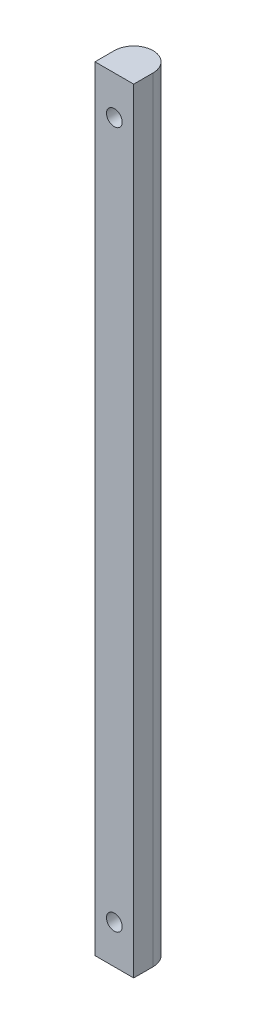
ISO-10303-21;
HEADER;
FILE_DESCRIPTION(('STEP AP214'),'2;1');
FILE_NAME('part.step','',(''),(''),'','','');
FILE_SCHEMA(('AUTOMOTIVE_DESIGN { 1 0 10303 214 1 1 1 1 }'));
ENDSEC;
DATA;
#1=APPLICATION_CONTEXT('core data for automotive mechanical design processes');
#2=APPLICATION_PROTOCOL_DEFINITION('international standard','automotive_design',2000,#1);
#3=PRODUCT_CONTEXT('',#1,'mechanical');
#4=PRODUCT('Part','Part','',(#3));
#5=PRODUCT_RELATED_PRODUCT_CATEGORY('part','',(#4));
#6=PRODUCT_DEFINITION_FORMATION('','',#4);
#7=PRODUCT_DEFINITION_CONTEXT('part definition',#1,'design');
#8=PRODUCT_DEFINITION('design','',#6,#7);
#9=PRODUCT_DEFINITION_SHAPE('','',#8);
#10=(LENGTH_UNIT() NAMED_UNIT(*) SI_UNIT(.MILLI.,.METRE.));
#11=(NAMED_UNIT(*) PLANE_ANGLE_UNIT() SI_UNIT($,.RADIAN.));
#12=(NAMED_UNIT(*) SI_UNIT($,.STERADIAN.) SOLID_ANGLE_UNIT());
#13=UNCERTAINTY_MEASURE_WITH_UNIT(LENGTH_MEASURE(1.E-05),#10,'distance_accuracy_value','');
#14=(GEOMETRIC_REPRESENTATION_CONTEXT(3) GLOBAL_UNCERTAINTY_ASSIGNED_CONTEXT((#13)) GLOBAL_UNIT_ASSIGNED_CONTEXT((#10,
#11,#12)) REPRESENTATION_CONTEXT('',''));
#15=CARTESIAN_POINT('',(0.,0.,0.));
#16=DIRECTION('',(0.,0.,1.));
#17=DIRECTION('',(1.,0.,0.));
#18=AXIS2_PLACEMENT_3D('',#15,#16,#17);
#19=CARTESIAN_POINT('',(0.,63.5,-3.175));
#20=DIRECTION('',(0.,-1.,0.));
#21=DIRECTION('',(0.,0.,-1.));
#22=AXIS2_PLACEMENT_3D('',#19,#20,#21);
#23=CYLINDRICAL_SURFACE('',#22,3.175);
#24=CARTESIAN_POINT('',(0.,55.86095,-6.35));
#25=CARTESIAN_POINT('',(0.0691991170808213,55.8609567880684,-6.34999494878284));
#26=CARTESIAN_POINT('',(0.138514448645236,55.8665553419764,-6.34771128002319));
#27=CARTESIAN_POINT('',(0.275187458737665,55.8887540186759,-6.33879808003825));
#28=CARTESIAN_POINT('',(0.342539383129634,55.9053836315021,-6.3321569001181));
#29=CARTESIAN_POINT('',(0.473087021310062,55.9489358399123,-6.31524364494565));
#30=CARTESIAN_POINT('',(0.536295708180401,55.9758243126415,-6.30498361510931));
#31=CARTESIAN_POINT('',(0.657246364636683,56.0389936535068,-6.28183907891045));
#32=CARTESIAN_POINT('',(0.714990136684524,56.0752714099811,-6.26895544232704));
#33=CARTESIAN_POINT('',(0.826242629051789,56.1580379875598,-6.24116693926225));
#34=CARTESIAN_POINT('',(0.879453289167607,56.2049058060068,-6.22619808843745));
#35=CARTESIAN_POINT('',(0.977512911869507,56.3067217100382,-6.19621300876413));
#36=CARTESIAN_POINT('',(1.0223576745505,56.361673829532,-6.18119675994665));
#37=CARTESIAN_POINT('',(1.10445361995858,56.4811769758469,-6.15204466177736));
#38=CARTESIAN_POINT('',(1.14125872964486,56.5460539994784,-6.13798144758871));
#39=CARTESIAN_POINT('',(1.20330090876947,56.6817334664035,-6.11333536275321));
#40=CARTESIAN_POINT('',(1.22854363847174,56.7525329902692,-6.10275078988582));
#41=CARTESIAN_POINT('',(1.26552995014933,56.894620296577,-6.08694932324813));
#42=CARTESIAN_POINT('',(1.27784529118986,56.9657331564385,-6.08150625748732));
#43=CARTESIAN_POINT('',(1.29041253820246,57.1092083227824,-6.07595030426477));
#44=CARTESIAN_POINT('',(1.29067062652423,57.1815699699077,-6.07583468515811));
#45=CARTESIAN_POINT('',(1.27954838927627,57.3199242161316,-6.08075429064617));
#46=CARTESIAN_POINT('',(1.26900566717996,57.385999922727,-6.08541882210551));
#47=CARTESIAN_POINT('',(1.23798066165121,57.5153478615879,-6.09874946121189));
#48=CARTESIAN_POINT('',(1.21749658508013,57.5786195858468,-6.10741629074641));
#49=CARTESIAN_POINT('',(1.16677664432287,57.7021162330619,-6.12796740817153));
#50=CARTESIAN_POINT('',(1.13634738556803,57.7622507786925,-6.13991468325851));
#51=CARTESIAN_POINT('',(1.06673695185949,57.8767858208651,-6.16566416352442));
#52=CARTESIAN_POINT('',(1.02755242891495,57.9311841121335,-6.17946707748856));
#53=CARTESIAN_POINT('',(0.937867550666353,58.0372738968994,-6.20871449812304));
#54=CARTESIAN_POINT('',(0.886713453390292,58.0884023759712,-6.22420207670568));
#55=CARTESIAN_POINT('',(0.776396004733482,58.1815383694806,-6.25413921024311));
#56=CARTESIAN_POINT('',(0.717230965144651,58.2235439565085,-6.26858854541569));
#57=CARTESIAN_POINT('',(0.590933707198553,58.2980111190829,-6.29520310800086));
#58=CARTESIAN_POINT('',(0.523660769986691,58.3302547761548,-6.30731426034368));
#59=CARTESIAN_POINT('',(0.384028809868178,58.3827722116859,-6.327476877027));
#60=CARTESIAN_POINT('',(0.31167247375507,58.4030522609455,-6.33553046784028));
#61=CARTESIAN_POINT('',(0.16864189868142,58.4299140357149,-6.34627953592641));
#62=CARTESIAN_POINT('',(0.0981318255811806,58.4372520101282,-6.34927037549045));
#63=CARTESIAN_POINT('',(-0.043169177857986,58.440262047857,-6.35049175469347));
#64=CARTESIAN_POINT('',(-0.113960027542248,58.4359372488407,-6.34872357466488));
#65=CARTESIAN_POINT('',(-0.250344995389918,58.4162954737281,-6.34081834382161));
#66=CARTESIAN_POINT('',(-0.316027571427203,58.4014999882194,-6.33488866781712));
#67=CARTESIAN_POINT('',(-0.443913481919008,58.3620521638474,-6.31947407528922));
#68=CARTESIAN_POINT('',(-0.506116370652852,58.3373985655176,-6.30998870450208));
#69=CARTESIAN_POINT('',(-0.627434557573652,58.2781286267577,-6.28801625437917));
#70=CARTESIAN_POINT('',(-0.686395814260256,58.2432288999057,-6.27544574313742));
#71=CARTESIAN_POINT('',(-0.797833822360258,58.1647706254623,-6.24865843400418));
#72=CARTESIAN_POINT('',(-0.850307918909784,58.1212085517127,-6.23444096667786));
#73=CARTESIAN_POINT('',(-0.951026543140731,58.0231924219967,-6.20470562715203));
#74=CARTESIAN_POINT('',(-0.998741114888624,57.9681992712312,-6.18916505256559));
#75=CARTESIAN_POINT('',(-1.08440104458421,57.8507208562238,-6.15941967611857));
#76=CARTESIAN_POINT('',(-1.12234458519762,57.7882342014126,-6.1452151230588));
#77=CARTESIAN_POINT('',(-1.18768318457141,57.6564805698983,-6.1197043178253));
#78=CARTESIAN_POINT('',(-1.21495482686028,57.5871452495226,-6.10843245344576));
#79=CARTESIAN_POINT('',(-1.25721698429186,57.4442685596938,-6.09057314753681));
#80=CARTESIAN_POINT('',(-1.2722169384638,57.3707304695601,-6.08398210616892));
#81=CARTESIAN_POINT('',(-1.28859508015926,57.2273829041568,-6.07676160650549));
#82=CARTESIAN_POINT('',(-1.2908967198223,57.1576986917889,-6.07572814139085));
#83=CARTESIAN_POINT('',(-1.28425228510169,57.0189837792386,-6.07867601428325));
#84=CARTESIAN_POINT('',(-1.2753077390997,56.9499529915389,-6.08265667086014));
#85=CARTESIAN_POINT('',(-1.24718689304565,56.8174792180329,-6.09482321951612));
#86=CARTESIAN_POINT('',(-1.22845580313664,56.7539233091184,-6.10282559452904));
#87=CARTESIAN_POINT('',(-1.18171667348739,56.6308345128285,-6.12199939284952));
#88=CARTESIAN_POINT('',(-1.15370605515248,56.5713027492249,-6.1331716968927));
#89=CARTESIAN_POINT('',(-1.08731746525223,56.4541668209852,-6.15823530583221));
#90=CARTESIAN_POINT('',(-1.04843009803694,56.3968776071093,-6.17224719173308));
#91=CARTESIAN_POINT('',(-0.962125250887948,56.2893483068532,-6.20105482524188));
#92=CARTESIAN_POINT('',(-0.914705059538204,56.2391104701986,-6.21585082095353));
#93=CARTESIAN_POINT('',(-0.80886574807768,56.1436193981101,-6.24576238710602));
#94=CARTESIAN_POINT('',(-0.749919587011669,56.0989332418308,-6.26083186881097));
#95=CARTESIAN_POINT('',(-0.624798009827094,56.0200690195441,-6.28857548380922));
#96=CARTESIAN_POINT('',(-0.558619280580835,55.9858957969248,-6.30124851200542));
#97=CARTESIAN_POINT('',(-0.422063336305997,55.9298091529994,-6.3225671606999));
#98=CARTESIAN_POINT('',(-0.351782819012536,55.9076866588813,-6.33128099638565));
#99=CARTESIAN_POINT('',(-0.208203856400575,55.8757651689365,-6.34397908859924));
#100=CARTESIAN_POINT('',(-0.134915707477548,55.8659272479027,-6.34797828179879));
#101=CARTESIAN_POINT('',(-0.0409571719211373,55.8614359448173,-6.34980333267174));
#102=CARTESIAN_POINT('',(-0.0204836774519347,55.8609479906593,-6.35000149521421));
#103=CARTESIAN_POINT('',(0.,55.86095,-6.35));
#104=B_SPLINE_CURVE_WITH_KNOTS('',3,(#24,#25,#26,#27,#28,#29,#30,#31,#32,#33,#34,#35,#36,#37,
#38,#39,#40,#41,#42,#43,#44,#45,#46,#47,#48,#49,#50,#51,#52,#53,#54,#55,#56,#57,#58,#59,#60,#61,
#62,#63,#64,#65,#66,#67,#68,#69,#70,#71,#72,#73,#74,#75,#76,#77,#78,#79,#80,#81,#82,#83,#84,#85,
#86,#87,#88,#89,#90,#91,#92,#93,#94,#95,#96,#97,#98,#99,#100,#101,#102,#103),.UNSPECIFIED.,.T.,
.F.,(4,2,2,2,2,2,2,2,2,2,2,2,2,2,2,2,2,2,2,2,2,2,2,2,2,2,2,2,2,2,2,2,2,2,2,2,2,2,2,4),(0.,
0.207541326616696,0.41563973492106,0.623051920280879,0.8303954558898,1.04686045973998,
1.26343384409847,1.49000426712627,1.71646365569271,1.93242050038482,2.14826661210771,
2.3485536522472,2.54887683192717,2.75335367180529,2.9579088373367,3.1787983054186,
3.39973439591492,3.62529000925708,3.85072729091376,4.0624909156462,4.27419757470954,
4.47604123804456,4.67791069704711,4.88599585529143,5.09416589223806,5.31648608861492,
5.53884760496836,5.76370959278771,5.98839846019679,6.19650800502098,6.40458927035164,
6.60393683866938,6.80333984820438,7.01437321947173,7.22547376814521,7.45085448578607,
7.67633888306081,7.89777542509606,8.11850852243959,8.17994297090803),.UNSPECIFIED.);
#105=CARTESIAN_POINT('',(0.,55.86095,-6.35));
#106=VERTEX_POINT('',#105);
#107=EDGE_CURVE('E11',#106,#106,#104,.T.);
#108=ORIENTED_EDGE('',*,*,#107,.T.);
#109=EDGE_LOOP('',(#108));
#110=FACE_BOUND('',#109,.T.);
#111=CARTESIAN_POINT('',(0.,-58.43905,-6.35));
#112=CARTESIAN_POINT('',(0.069199117080821,-58.4390432119316,-6.34999494878284));
#113=CARTESIAN_POINT('',(0.138514448645235,-58.4334446580236,-6.34771128002319));
#114=CARTESIAN_POINT('',(0.275187458737664,-58.4112459813241,-6.33879808003825));
#115=CARTESIAN_POINT('',(0.342539383129634,-58.3946163684979,-6.3321569001181));
#116=CARTESIAN_POINT('',(0.473087021310062,-58.3510641600877,-6.31524364494565));
#117=CARTESIAN_POINT('',(0.536295708180401,-58.3241756873584,-6.30498361510931));
#118=CARTESIAN_POINT('',(0.657246364636683,-58.2610063464932,-6.28183907891045));
#119=CARTESIAN_POINT('',(0.714990136684524,-58.2247285900189,-6.26895544232704));
#120=CARTESIAN_POINT('',(0.826242629051792,-58.1419620124402,-6.24116693926225));
#121=CARTESIAN_POINT('',(0.879453289167612,-58.0950941939932,-6.22619808843745));
#122=CARTESIAN_POINT('',(0.977512911869511,-57.9932782899618,-6.19621300876413));
#123=CARTESIAN_POINT('',(1.0223576745505,-57.938326170468,-6.18119675994665));
#124=CARTESIAN_POINT('',(1.10445361995858,-57.8188230241531,-6.15204466177736));
#125=CARTESIAN_POINT('',(1.14125872964486,-57.7539460005216,-6.1379814475887));
#126=CARTESIAN_POINT('',(1.20330090876947,-57.6182665335965,-6.11333536275321));
#127=CARTESIAN_POINT('',(1.22854363847174,-57.5474670097308,-6.10275078988582));
#128=CARTESIAN_POINT('',(1.26552995014934,-57.405379703423,-6.08694932324813));
#129=CARTESIAN_POINT('',(1.27784529118986,-57.3342668435615,-6.08150625748732));
#130=CARTESIAN_POINT('',(1.29041253820246,-57.1907916772176,-6.07595030426477));
#131=CARTESIAN_POINT('',(1.29067062652423,-57.1184300300923,-6.07583468515811));
#132=CARTESIAN_POINT('',(1.27954838927627,-56.9800757838684,-6.08075429064617));
#133=CARTESIAN_POINT('',(1.26900566717996,-56.914000077273,-6.08541882210551));
#134=CARTESIAN_POINT('',(1.23798066165121,-56.7846521384121,-6.09874946121189));
#135=CARTESIAN_POINT('',(1.21749658508013,-56.7213804141532,-6.10741629074641));
#136=CARTESIAN_POINT('',(1.16677664432287,-56.5978837669381,-6.12796740817153));
#137=CARTESIAN_POINT('',(1.13634738556803,-56.5377492213075,-6.1399146832585));
#138=CARTESIAN_POINT('',(1.06673695185949,-56.423214179135,-6.16566416352442));
#139=CARTESIAN_POINT('',(1.02755242891496,-56.3688158878665,-6.17946707748856));
#140=CARTESIAN_POINT('',(0.937867550666353,-56.2627261031006,-6.20871449812304));
#141=CARTESIAN_POINT('',(0.886713453390292,-56.2115976240288,-6.22420207670568));
#142=CARTESIAN_POINT('',(0.776396004733482,-56.1184616305194,-6.25413921024311));
#143=CARTESIAN_POINT('',(0.717230965144651,-56.0764560434915,-6.26858854541569));
#144=CARTESIAN_POINT('',(0.590933707198553,-56.0019888809171,-6.29520310800086));
#145=CARTESIAN_POINT('',(0.523660769986691,-55.9697452238452,-6.30731426034368));
#146=CARTESIAN_POINT('',(0.384028809868178,-55.9172277883141,-6.327476877027));
#147=CARTESIAN_POINT('',(0.31167247375507,-55.8969477390545,-6.33553046784028));
#148=CARTESIAN_POINT('',(0.16864189868142,-55.8700859642851,-6.34627953592641));
#149=CARTESIAN_POINT('',(0.0981318255811804,-55.8627479898718,-6.34927037549045));
#150=CARTESIAN_POINT('',(-0.0431691778579861,-55.859737952143,-6.35049175469347));
#151=CARTESIAN_POINT('',(-0.113960027542248,-55.8640627511593,-6.34872357466488));
#152=CARTESIAN_POINT('',(-0.25034499538992,-55.8837045262719,-6.34081834382161));
#153=CARTESIAN_POINT('',(-0.316027571427207,-55.8985000117806,-6.33488866781712));
#154=CARTESIAN_POINT('',(-0.443913481919012,-55.9379478361526,-6.31947407528921));
#155=CARTESIAN_POINT('',(-0.506116370652853,-55.9626014344824,-6.30998870450208));
#156=CARTESIAN_POINT('',(-0.627434557573654,-56.0218713732423,-6.28801625437917));
#157=CARTESIAN_POINT('',(-0.686395814260261,-56.0567711000943,-6.27544574313742));
#158=CARTESIAN_POINT('',(-0.797833822360263,-56.1352293745377,-6.24865843400418));
#159=CARTESIAN_POINT('',(-0.850307918909786,-56.1787914482873,-6.23444096667786));
#160=CARTESIAN_POINT('',(-0.951026543140731,-56.2768075780033,-6.20470562715203));
#161=CARTESIAN_POINT('',(-0.998741114888624,-56.3318007287688,-6.18916505256559));
#162=CARTESIAN_POINT('',(-1.08440104458421,-56.4492791437762,-6.15941967611857));
#163=CARTESIAN_POINT('',(-1.12234458519762,-56.5117657985874,-6.1452151230588));
#164=CARTESIAN_POINT('',(-1.18768318457141,-56.6435194301017,-6.1197043178253));
#165=CARTESIAN_POINT('',(-1.21495482686028,-56.7128547504774,-6.10843245344576));
#166=CARTESIAN_POINT('',(-1.25721698429186,-56.8557314403062,-6.09057314753681));
#167=CARTESIAN_POINT('',(-1.2722169384638,-56.9292695304399,-6.08398210616892));
#168=CARTESIAN_POINT('',(-1.28859508015926,-57.0726170958432,-6.07676160650549));
#169=CARTESIAN_POINT('',(-1.2908967198223,-57.1423013082111,-6.07572814139085));
#170=CARTESIAN_POINT('',(-1.28425228510169,-57.2810162207614,-6.07867601428325));
#171=CARTESIAN_POINT('',(-1.2753077390997,-57.3500470084611,-6.08265667086014));
#172=CARTESIAN_POINT('',(-1.24718689304565,-57.4825207819671,-6.09482321951612));
#173=CARTESIAN_POINT('',(-1.22845580313664,-57.5460766908816,-6.10282559452904));
#174=CARTESIAN_POINT('',(-1.18171667348739,-57.6691654871715,-6.12199939284952));
#175=CARTESIAN_POINT('',(-1.15370605515248,-57.7286972507751,-6.1331716968927));
#176=CARTESIAN_POINT('',(-1.08731746525223,-57.8458331790148,-6.15823530583221));
#177=CARTESIAN_POINT('',(-1.04843009803694,-57.9031223928907,-6.17224719173308));
#178=CARTESIAN_POINT('',(-0.962125250887948,-58.0106516931468,-6.20105482524188));
#179=CARTESIAN_POINT('',(-0.914705059538204,-58.0608895298014,-6.21585082095353));
#180=CARTESIAN_POINT('',(-0.80886574807768,-58.1563806018899,-6.24576238710602));
#181=CARTESIAN_POINT('',(-0.749919587011669,-58.2010667581692,-6.26083186881097));
#182=CARTESIAN_POINT('',(-0.624798009827094,-58.2799309804559,-6.28857548380922));
#183=CARTESIAN_POINT('',(-0.558619280580835,-58.3141042030753,-6.30124851200542));
#184=CARTESIAN_POINT('',(-0.422063336305997,-58.3701908470006,-6.3225671606999));
#185=CARTESIAN_POINT('',(-0.351782819012536,-58.3923133411187,-6.33128099638565));
#186=CARTESIAN_POINT('',(-0.208203856400575,-58.4242348310635,-6.34397908859924));
#187=CARTESIAN_POINT('',(-0.134915707477548,-58.4340727520973,-6.34797828179879));
#188=CARTESIAN_POINT('',(-0.0409571719211373,-58.4385640551827,-6.34980333267174));
#189=CARTESIAN_POINT('',(-0.0204836774519347,-58.4390520093407,-6.35000149521421));
#190=CARTESIAN_POINT('',(0.,-58.43905,-6.35));
#191=B_SPLINE_CURVE_WITH_KNOTS('',3,(#111,#112,#113,#114,#115,#116,#117,#118,#119,#120,#121,
#122,#123,#124,#125,#126,#127,#128,#129,#130,#131,#132,#133,#134,#135,#136,#137,#138,#139,#140,
#141,#142,#143,#144,#145,#146,#147,#148,#149,#150,#151,#152,#153,#154,#155,#156,#157,#158,#159,
#160,#161,#162,#163,#164,#165,#166,#167,#168,#169,#170,#171,#172,#173,#174,#175,#176,#177,#178,
#179,#180,#181,#182,#183,#184,#185,#186,#187,#188,#189,#190),.UNSPECIFIED.,.T.,.F.,(4,2,2,2,2,2,
2,2,2,2,2,2,2,2,2,2,2,2,2,2,2,2,2,2,2,2,2,2,2,2,2,2,2,2,2,2,2,2,2,4),(0.,0.207541326616695,
0.41563973492106,0.623051920280879,0.8303954558898,1.04686045973999,1.26343384409847,
1.49000426712627,1.71646365569271,1.93242050038484,2.14826661210771,2.3485536522472,
2.54887683192717,2.75335367180528,2.9579088373367,3.1787983054186,3.39973439591492,
3.62529000925708,3.85072729091376,4.0624909156462,4.27419757470954,4.47604123804456,
4.67791069704711,4.88599585529144,5.09416589223806,5.31648608861492,5.53884760496836,
5.76370959278772,5.98839846019679,6.19650800502098,6.40458927035164,6.60393683866938,
6.80333984820438,7.01437321947173,7.22547376814521,7.45085448578607,7.67633888306081,
7.89777542509606,8.1185085224396,8.17994297090803),.UNSPECIFIED.);
#192=CARTESIAN_POINT('',(0.,-58.43905,-6.35));
#193=VERTEX_POINT('',#192);
#194=EDGE_CURVE('E57',#193,#193,#191,.T.);
#195=ORIENTED_EDGE('',*,*,#194,.T.);
#196=EDGE_LOOP('',(#195));
#197=FACE_BOUND('',#196,.T.);
#198=CARTESIAN_POINT('',(0.,-63.5,-3.175));
#199=DIRECTION('',(0.,1.,0.));
#200=DIRECTION('',(0.,0.,-1.));
#201=AXIS2_PLACEMENT_3D('',#198,#199,#200);
#202=CIRCLE('',#201,3.175);
#203=CARTESIAN_POINT('',(3.175,-63.5,-3.175));
#204=VERTEX_POINT('',#203);
#205=CARTESIAN_POINT('',(-3.175,-63.5,-3.175));
#206=VERTEX_POINT('',#205);
#207=EDGE_CURVE('E120',#204,#206,#202,.T.);
#208=ORIENTED_EDGE('',*,*,#207,.T.);
#209=DIRECTION('',(0.,-1.,0.));
#210=VECTOR('',#209,1.);
#211=CARTESIAN_POINT('',(-3.175,63.5,-3.175));
#212=LINE('',#211,#210);
#213=CARTESIAN_POINT('',(-3.175,63.5,-3.175));
#214=VERTEX_POINT('',#213);
#215=EDGE_CURVE('E109',#214,#206,#212,.T.);
#216=ORIENTED_EDGE('',*,*,#215,.F.);
#217=CARTESIAN_POINT('',(0.,63.5,-3.175));
#218=DIRECTION('',(0.,1.,0.));
#219=DIRECTION('',(0.,0.,-1.));
#220=AXIS2_PLACEMENT_3D('',#217,#218,#219);
#221=CIRCLE('',#220,3.175);
#222=CARTESIAN_POINT('',(3.175,63.5,-3.175));
#223=VERTEX_POINT('',#222);
#224=EDGE_CURVE('E101',#223,#214,#221,.T.);
#225=ORIENTED_EDGE('',*,*,#224,.F.);
#226=DIRECTION('',(0.,-1.,0.));
#227=VECTOR('',#226,1.);
#228=CARTESIAN_POINT('',(3.175,63.5,-3.175));
#229=LINE('',#228,#227);
#230=EDGE_CURVE('E116',#223,#204,#229,.T.);
#231=ORIENTED_EDGE('',*,*,#230,.T.);
#232=EDGE_LOOP('',(#208,#216,#225,#231));
#233=FACE_BOUND('',#232,.T.);
#234=ADVANCED_FACE('F43',(#110,#197,#233),#23,.T.);
#235=CARTESIAN_POINT('',(-3.175,63.5,-3.175));
#236=DIRECTION('',(1.,0.,0.));
#237=DIRECTION('',(0.,0.,-1.));
#238=AXIS2_PLACEMENT_3D('',#235,#236,#237);
#239=PLANE('',#238);
#240=DIRECTION('',(0.,0.,1.));
#241=VECTOR('',#240,1.);
#242=CARTESIAN_POINT('',(-3.175,-63.5,-3.175));
#243=LINE('',#242,#241);
#244=CARTESIAN_POINT('',(-3.175,-63.5,0.));
#245=VERTEX_POINT('',#244);
#246=EDGE_CURVE('E107',#206,#245,#243,.T.);
#247=ORIENTED_EDGE('',*,*,#246,.T.);
#248=DIRECTION('',(0.,-1.,0.));
#249=VECTOR('',#248,1.);
#250=CARTESIAN_POINT('',(-3.175,63.5,0.));
#251=LINE('',#250,#249);
#252=CARTESIAN_POINT('',(-3.175,63.5,0.));
#253=VERTEX_POINT('',#252);
#254=EDGE_CURVE('E105',#253,#245,#251,.T.);
#255=ORIENTED_EDGE('',*,*,#254,.F.);
#256=DIRECTION('',(0.,0.,1.));
#257=VECTOR('',#256,1.);
#258=CARTESIAN_POINT('',(-3.175,63.5,-3.175));
#259=LINE('',#258,#257);
#260=EDGE_CURVE('E96',#214,#253,#259,.T.);
#261=ORIENTED_EDGE('',*,*,#260,.F.);
#262=ORIENTED_EDGE('',*,*,#215,.T.);
#263=EDGE_LOOP('',(#247,#255,#261,#262));
#264=FACE_BOUND('',#263,.T.);
#265=ADVANCED_FACE('F106',(#264),#239,.F.);
#266=CARTESIAN_POINT('',(-3.175,63.5,0.));
#267=DIRECTION('',(0.,0.,-1.));
#268=DIRECTION('',(-1.,0.,0.));
#269=AXIS2_PLACEMENT_3D('',#266,#267,#268);
#270=PLANE('',#269);
#271=CARTESIAN_POINT('',(0.,57.15,0.));
#272=DIRECTION('',(0.,0.,1.));
#273=DIRECTION('',(1.,0.,0.));
#274=AXIS2_PLACEMENT_3D('',#271,#272,#273);
#275=CIRCLE('',#274,1.28905);
#276=CARTESIAN_POINT('',(1.28905,57.15,0.));
#277=VERTEX_POINT('',#276);
#278=EDGE_CURVE('E177',#277,#277,#275,.T.);
#279=ORIENTED_EDGE('',*,*,#278,.F.);
#280=EDGE_LOOP('',(#279));
#281=FACE_BOUND('',#280,.T.);
#282=CARTESIAN_POINT('',(0.,-57.15,0.));
#283=DIRECTION('',(0.,0.,1.));
#284=DIRECTION('',(1.,0.,0.));
#285=AXIS2_PLACEMENT_3D('',#282,#283,#284);
#286=CIRCLE('',#285,1.28905);
#287=CARTESIAN_POINT('',(1.28905,-57.15,0.));
#288=VERTEX_POINT('',#287);
#289=EDGE_CURVE('E124',#288,#288,#286,.T.);
#290=ORIENTED_EDGE('',*,*,#289,.F.);
#291=EDGE_LOOP('',(#290));
#292=FACE_BOUND('',#291,.T.);
#293=DIRECTION('',(1.,0.,0.));
#294=VECTOR('',#293,1.);
#295=CARTESIAN_POINT('',(-3.175,-63.5,0.));
#296=LINE('',#295,#294);
#297=CARTESIAN_POINT('',(3.175,-63.5,0.));
#298=VERTEX_POINT('',#297);
#299=EDGE_CURVE('E82',#245,#298,#296,.T.);
#300=ORIENTED_EDGE('',*,*,#299,.T.);
#301=DIRECTION('',(0.,-1.,0.));
#302=VECTOR('',#301,1.);
#303=CARTESIAN_POINT('',(3.175,63.5,0.));
#304=LINE('',#303,#302);
#305=CARTESIAN_POINT('',(3.175,63.5,0.));
#306=VERTEX_POINT('',#305);
#307=EDGE_CURVE('E110',#306,#298,#304,.T.);
#308=ORIENTED_EDGE('',*,*,#307,.F.);
#309=DIRECTION('',(1.,0.,0.));
#310=VECTOR('',#309,1.);
#311=CARTESIAN_POINT('',(-3.175,63.5,0.));
#312=LINE('',#311,#310);
#313=EDGE_CURVE('E99',#253,#306,#312,.T.);
#314=ORIENTED_EDGE('',*,*,#313,.F.);
#315=ORIENTED_EDGE('',*,*,#254,.T.);
#316=EDGE_LOOP('',(#300,#308,#314,#315));
#317=FACE_BOUND('',#316,.T.);
#318=ADVANCED_FACE('F112',(#281,#292,#317),#270,.F.);
#319=CARTESIAN_POINT('',(3.175,63.5,0.));
#320=DIRECTION('',(-1.,0.,0.));
#321=DIRECTION('',(0.,0.,1.));
#322=AXIS2_PLACEMENT_3D('',#319,#320,#321);
#323=PLANE('',#322);
#324=DIRECTION('',(0.,0.,-1.));
#325=VECTOR('',#324,1.);
#326=CARTESIAN_POINT('',(3.175,-63.5,0.));
#327=LINE('',#326,#325);
#328=EDGE_CURVE('E88',#298,#204,#327,.T.);
#329=ORIENTED_EDGE('',*,*,#328,.T.);
#330=ORIENTED_EDGE('',*,*,#230,.F.);
#331=DIRECTION('',(0.,0.,-1.));
#332=VECTOR('',#331,1.);
#333=CARTESIAN_POINT('',(3.175,63.5,0.));
#334=LINE('',#333,#332);
#335=EDGE_CURVE('E65',#306,#223,#334,.T.);
#336=ORIENTED_EDGE('',*,*,#335,.F.);
#337=ORIENTED_EDGE('',*,*,#307,.T.);
#338=EDGE_LOOP('',(#329,#330,#336,#337));
#339=FACE_BOUND('',#338,.T.);
#340=ADVANCED_FACE('F152',(#339),#323,.F.);
#341=CARTESIAN_POINT('',(0.,63.5,-3.175));
#342=DIRECTION('',(0.,-1.,0.));
#343=DIRECTION('',(0.,0.,-1.));
#344=AXIS2_PLACEMENT_3D('',#341,#342,#343);
#345=PLANE('',#344);
#346=ORIENTED_EDGE('',*,*,#224,.T.);
#347=ORIENTED_EDGE('',*,*,#260,.T.);
#348=ORIENTED_EDGE('',*,*,#313,.T.);
#349=ORIENTED_EDGE('',*,*,#335,.T.);
#350=EDGE_LOOP('',(#346,#347,#348,#349));
#351=FACE_BOUND('',#350,.T.);
#352=ADVANCED_FACE('F97',(#351),#345,.F.);
#353=CARTESIAN_POINT('',(0.,-63.5,-3.175));
#354=DIRECTION('',(0.,-1.,0.));
#355=DIRECTION('',(0.,0.,-1.));
#356=AXIS2_PLACEMENT_3D('',#353,#354,#355);
#357=PLANE('',#356);
#358=ORIENTED_EDGE('',*,*,#207,.F.);
#359=ORIENTED_EDGE('',*,*,#328,.F.);
#360=ORIENTED_EDGE('',*,*,#299,.F.);
#361=ORIENTED_EDGE('',*,*,#246,.F.);
#362=EDGE_LOOP('',(#358,#359,#360,#361));
#363=FACE_BOUND('',#362,.T.);
#364=ADVANCED_FACE('F147',(#363),#357,.T.);
#365=CARTESIAN_POINT('',(0.,-57.15,0.));
#366=DIRECTION('',(0.,0.,1.));
#367=DIRECTION('',(1.,0.,0.));
#368=AXIS2_PLACEMENT_3D('',#365,#366,#367);
#369=CYLINDRICAL_SURFACE('',#368,1.28905);
#370=ORIENTED_EDGE('',*,*,#289,.T.);
#371=EDGE_LOOP('',(#370));
#372=FACE_BOUND('',#371,.T.);
#373=ORIENTED_EDGE('',*,*,#194,.F.);
#374=EDGE_LOOP('',(#373));
#375=FACE_BOUND('',#374,.T.);
#376=ADVANCED_FACE('F142',(#372,#375),#369,.F.);
#377=CARTESIAN_POINT('',(0.,57.15,0.));
#378=DIRECTION('',(0.,0.,1.));
#379=DIRECTION('',(1.,0.,0.));
#380=AXIS2_PLACEMENT_3D('',#377,#378,#379);
#381=CYLINDRICAL_SURFACE('',#380,1.28905);
#382=ORIENTED_EDGE('',*,*,#278,.T.);
#383=EDGE_LOOP('',(#382));
#384=FACE_BOUND('',#383,.T.);
#385=ORIENTED_EDGE('',*,*,#107,.F.);
#386=EDGE_LOOP('',(#385));
#387=FACE_BOUND('',#386,.T.);
#388=ADVANCED_FACE('F146',(#384,#387),#381,.F.);
#389=CLOSED_SHELL('',(#234,#265,#318,#340,#352,#364,#376,#388));
#390=MANIFOLD_SOLID_BREP('B2',#389);
#391=ADVANCED_BREP_SHAPE_REPRESENTATION('',(#18,#390),#14);
#392=SHAPE_DEFINITION_REPRESENTATION(#9,#391);
ENDSEC;
END-ISO-10303-21;
